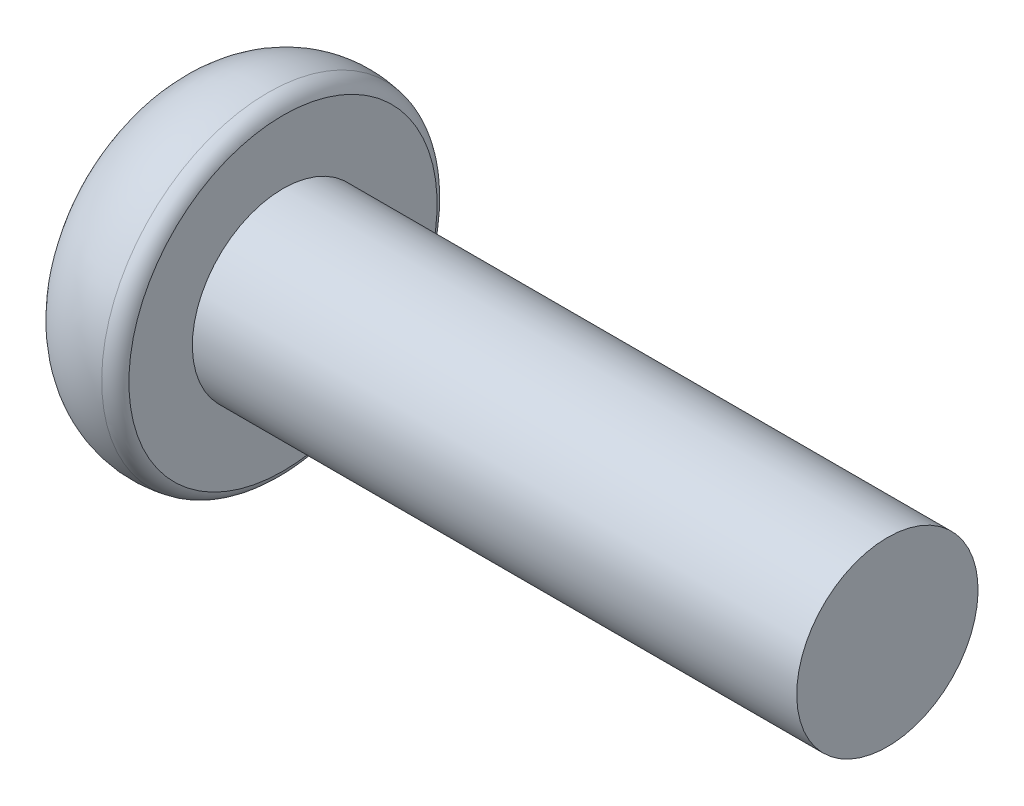
ISO-10303-21;
HEADER;
FILE_DESCRIPTION(('STEP AP214'),'2;1');
FILE_NAME('part.step','',(''),(''),'','','');
FILE_SCHEMA(('AUTOMOTIVE_DESIGN { 1 0 10303 214 1 1 1 1 }'));
ENDSEC;
DATA;
#1=APPLICATION_CONTEXT('core data for automotive mechanical design processes');
#2=APPLICATION_PROTOCOL_DEFINITION('international standard','automotive_design',2000,#1);
#3=PRODUCT_CONTEXT('',#1,'mechanical');
#4=PRODUCT('Part','Part','',(#3));
#5=PRODUCT_RELATED_PRODUCT_CATEGORY('part','',(#4));
#6=PRODUCT_DEFINITION_FORMATION('','',#4);
#7=PRODUCT_DEFINITION_CONTEXT('part definition',#1,'design');
#8=PRODUCT_DEFINITION('design','',#6,#7);
#9=PRODUCT_DEFINITION_SHAPE('','',#8);
#10=(LENGTH_UNIT() NAMED_UNIT(*) SI_UNIT(.MILLI.,.METRE.));
#11=(NAMED_UNIT(*) PLANE_ANGLE_UNIT() SI_UNIT($,.RADIAN.));
#12=(NAMED_UNIT(*) SI_UNIT($,.STERADIAN.) SOLID_ANGLE_UNIT());
#13=UNCERTAINTY_MEASURE_WITH_UNIT(LENGTH_MEASURE(1.E-05),#10,'distance_accuracy_value','');
#14=(GEOMETRIC_REPRESENTATION_CONTEXT(3) GLOBAL_UNCERTAINTY_ASSIGNED_CONTEXT((#13)) GLOBAL_UNIT_ASSIGNED_CONTEXT((#10,
#11,#12)) REPRESENTATION_CONTEXT('',''));
#15=CARTESIAN_POINT('',(0.,0.,0.));
#16=DIRECTION('',(0.,0.,1.));
#17=DIRECTION('',(1.,0.,0.));
#18=AXIS2_PLACEMENT_3D('',#15,#16,#17);
#19=CARTESIAN_POINT('',(0.,2.1,0.));
#20=DIRECTION('',(1.,0.,0.));
#21=DIRECTION('',(0.,1.,0.));
#22=AXIS2_PLACEMENT_3D('',#19,#20,#21);
#23=PLANE('',#22);
#24=CARTESIAN_POINT('',(0.,-3.,0.));
#25=DIRECTION('',(1.,0.,0.));
#26=DIRECTION('',(0.,1.,0.));
#27=AXIS2_PLACEMENT_3D('',#24,#25,#26);
#28=CIRCLE('',#27,5.1);
#29=CARTESIAN_POINT('',(0.,2.1,0.));
#30=VERTEX_POINT('',#29);
#31=EDGE_CURVE('E138',#30,#30,#28,.T.);
#32=ORIENTED_EDGE('',*,*,#31,.T.);
#33=EDGE_LOOP('',(#32));
#34=FACE_BOUND('',#33,.T.);
#35=CARTESIAN_POINT('',(0.,-3.,0.));
#36=DIRECTION('',(1.,0.,0.));
#37=DIRECTION('',(0.,1.,0.));
#38=AXIS2_PLACEMENT_3D('',#35,#36,#37);
#39=CIRCLE('',#38,3.);
#40=CARTESIAN_POINT('',(0.,0.,0.));
#41=VERTEX_POINT('',#40);
#42=EDGE_CURVE('E11',#41,#41,#39,.T.);
#43=ORIENTED_EDGE('',*,*,#42,.F.);
#44=EDGE_LOOP('',(#43));
#45=FACE_BOUND('',#44,.T.);
#46=ADVANCED_FACE('F37',(#34,#45),#23,.T.);
#47=CARTESIAN_POINT('',(20.,-3.,0.));
#48=DIRECTION('',(1.,0.,0.));
#49=DIRECTION('',(0.,1.,0.));
#50=AXIS2_PLACEMENT_3D('',#47,#48,#49);
#51=CYLINDRICAL_SURFACE('',#50,3.);
#52=ORIENTED_EDGE('',*,*,#42,.T.);
#53=EDGE_LOOP('',(#52));
#54=FACE_BOUND('',#53,.T.);
#55=CARTESIAN_POINT('',(20.,-3.,0.));
#56=DIRECTION('',(1.,0.,0.));
#57=DIRECTION('',(0.,1.,0.));
#58=AXIS2_PLACEMENT_3D('',#55,#56,#57);
#59=CIRCLE('',#58,3.);
#60=CARTESIAN_POINT('',(20.,0.,0.));
#61=VERTEX_POINT('',#60);
#62=EDGE_CURVE('E44',#61,#61,#59,.T.);
#63=ORIENTED_EDGE('',*,*,#62,.F.);
#64=EDGE_LOOP('',(#63));
#65=FACE_BOUND('',#64,.T.);
#66=ADVANCED_FACE('F156',(#54,#65),#51,.T.);
#67=CARTESIAN_POINT('',(20.,0.,0.));
#68=DIRECTION('',(1.,0.,0.));
#69=DIRECTION('',(0.,1.,0.));
#70=AXIS2_PLACEMENT_3D('',#67,#68,#69);
#71=PLANE('',#70);
#72=ORIENTED_EDGE('',*,*,#62,.T.);
#73=EDGE_LOOP('',(#72));
#74=FACE_BOUND('',#73,.T.);
#75=ADVANCED_FACE('F154',(#74),#71,.T.);
#76=CARTESIAN_POINT('',(-4.,-3.,0.));
#77=DIRECTION('',(-1.,0.,0.));
#78=DIRECTION('',(0.,-1.,0.));
#79=AXIS2_PLACEMENT_3D('',#76,#77,#78);
#80=PLANE('',#79);
#81=DIRECTION('',(0.,0.5,-0.866025403784439));
#82=VECTOR('',#81,1.);
#83=CARTESIAN_POINT('',(-4.,-1.72982940778283,2.2));
#84=LINE('',#83,#82);
#85=CARTESIAN_POINT('',(-4.,-1.72982940778283,2.2));
#86=VERTEX_POINT('',#85);
#87=CARTESIAN_POINT('',(-4.,-0.45965881556565,0.));
#88=VERTEX_POINT('',#87);
#89=EDGE_CURVE('E51',#86,#88,#84,.T.);
#90=ORIENTED_EDGE('',*,*,#89,.F.);
#91=DIRECTION('',(0.,1.,0.));
#92=VECTOR('',#91,1.);
#93=CARTESIAN_POINT('',(-4.,-4.27017059221718,2.2));
#94=LINE('',#93,#92);
#95=CARTESIAN_POINT('',(-4.,-4.27017059221718,2.2));
#96=VERTEX_POINT('',#95);
#97=EDGE_CURVE('E134',#96,#86,#94,.T.);
#98=ORIENTED_EDGE('',*,*,#97,.F.);
#99=DIRECTION('',(0.,0.5,0.866025403784439));
#100=VECTOR('',#99,1.);
#101=CARTESIAN_POINT('',(-4.,-5.54034118443435,0.));
#102=LINE('',#101,#100);
#103=CARTESIAN_POINT('',(-4.,-5.54034118443435,0.));
#104=VERTEX_POINT('',#103);
#105=EDGE_CURVE('E132',#104,#96,#102,.T.);
#106=ORIENTED_EDGE('',*,*,#105,.F.);
#107=DIRECTION('',(0.,-0.499999999999999,0.866025403784439));
#108=VECTOR('',#107,1.);
#109=CARTESIAN_POINT('',(-4.,-4.27017059221718,-2.2));
#110=LINE('',#109,#108);
#111=CARTESIAN_POINT('',(-4.,-4.27017059221718,-2.2));
#112=VERTEX_POINT('',#111);
#113=EDGE_CURVE('E99',#112,#104,#110,.T.);
#114=ORIENTED_EDGE('',*,*,#113,.F.);
#115=DIRECTION('',(0.,-1.,0.));
#116=VECTOR('',#115,1.);
#117=CARTESIAN_POINT('',(-4.,-1.72982940778283,-2.2));
#118=LINE('',#117,#116);
#119=CARTESIAN_POINT('',(-4.,-1.72982940778283,-2.2));
#120=VERTEX_POINT('',#119);
#121=EDGE_CURVE('E128',#120,#112,#118,.T.);
#122=ORIENTED_EDGE('',*,*,#121,.F.);
#123=DIRECTION('',(0.,-0.5,-0.866025403784439));
#124=VECTOR('',#123,1.);
#125=CARTESIAN_POINT('',(-4.,-0.45965881556565,0.));
#126=LINE('',#125,#124);
#127=EDGE_CURVE('E125',#88,#120,#126,.T.);
#128=ORIENTED_EDGE('',*,*,#127,.F.);
#129=EDGE_LOOP('',(#90,#98,#106,#114,#122,#128));
#130=FACE_BOUND('',#129,.T.);
#131=CARTESIAN_POINT('',(-4.,-3.,0.));
#132=DIRECTION('',(1.,0.,0.));
#133=DIRECTION('',(0.,1.,0.));
#134=AXIS2_PLACEMENT_3D('',#131,#132,#133);
#135=CIRCLE('',#134,3.);
#136=CARTESIAN_POINT('',(-4.,0.,0.));
#137=VERTEX_POINT('',#136);
#138=EDGE_CURVE('E149',#137,#137,#135,.T.);
#139=ORIENTED_EDGE('',*,*,#138,.F.);
#140=EDGE_LOOP('',(#139));
#141=FACE_BOUND('',#140,.T.);
#142=ADVANCED_FACE('F163',(#130,#141),#80,.T.);
#143=CARTESIAN_POINT('',(-1.06784095824631,-3.,0.));
#144=DIRECTION('',(1.,0.,0.));
#145=DIRECTION('',(0.,1.,0.));
#146=AXIS2_PLACEMENT_3D('',#143,#144,#145);
#147=DEGENERATE_TOROIDAL_SURFACE('',#146,2.59497734154483,2.96,.T.);
#148=ORIENTED_EDGE('',*,*,#138,.T.);
#149=EDGE_LOOP('',(#148));
#150=FACE_BOUND('',#149,.T.);
#151=CARTESIAN_POINT('',(-0.5,-3.,0.));
#152=DIRECTION('',(1.,0.,0.));
#153=DIRECTION('',(0.,1.,0.));
#154=AXIS2_PLACEMENT_3D('',#151,#152,#153);
#155=CIRCLE('',#154,5.5);
#156=CARTESIAN_POINT('',(-0.500000000000001,2.5,0.));
#157=VERTEX_POINT('',#156);
#158=EDGE_CURVE('E146',#157,#157,#155,.T.);
#159=ORIENTED_EDGE('',*,*,#158,.F.);
#160=EDGE_LOOP('',(#159));
#161=FACE_BOUND('',#160,.T.);
#162=ADVANCED_FACE('F169',(#150,#161),#147,.T.);
#163=CARTESIAN_POINT('',(-0.566998114943999,-3.,0.));
#164=DIRECTION('',(1.,0.,0.));
#165=DIRECTION('',(0.,1.,0.));
#166=AXIS2_PLACEMENT_3D('',#163,#164,#165);
#167=TOROIDAL_SURFACE('',#166,4.90375235632,0.6);
#168=ORIENTED_EDGE('',*,*,#158,.T.);
#169=EDGE_LOOP('',(#168));
#170=FACE_BOUND('',#169,.T.);
#171=ORIENTED_EDGE('',*,*,#31,.F.);
#172=EDGE_LOOP('',(#171));
#173=FACE_BOUND('',#172,.T.);
#174=ADVANCED_FACE('F173',(#170,#173),#167,.T.);
#175=CARTESIAN_POINT('',(-1.,-1.72982940778283,2.2));
#176=DIRECTION('',(0.,0.866025403784439,0.5));
#177=DIRECTION('',(0.,-0.5,0.866025403784439));
#178=AXIS2_PLACEMENT_3D('',#175,#176,#177);
#179=PLANE('',#178);
#180=ORIENTED_EDGE('',*,*,#89,.T.);
#181=DIRECTION('',(-1.,0.,0.));
#182=VECTOR('',#181,1.);
#183=CARTESIAN_POINT('',(-1.,-0.45965881556565,0.));
#184=LINE('',#183,#182);
#185=CARTESIAN_POINT('',(-1.,-0.45965881556565,0.));
#186=VERTEX_POINT('',#185);
#187=EDGE_CURVE('E81',#186,#88,#184,.T.);
#188=ORIENTED_EDGE('',*,*,#187,.F.);
#189=DIRECTION('',(0.,0.5,-0.866025403784439));
#190=VECTOR('',#189,1.);
#191=CARTESIAN_POINT('',(-1.,-1.72982940778283,2.2));
#192=LINE('',#191,#190);
#193=CARTESIAN_POINT('',(-1.,-1.72982940778283,2.2));
#194=VERTEX_POINT('',#193);
#195=EDGE_CURVE('E136',#194,#186,#192,.T.);
#196=ORIENTED_EDGE('',*,*,#195,.F.);
#197=DIRECTION('',(-1.,0.,0.));
#198=VECTOR('',#197,1.);
#199=CARTESIAN_POINT('',(-1.,-1.72982940778283,2.2));
#200=LINE('',#199,#198);
#201=EDGE_CURVE('E59',#194,#86,#200,.T.);
#202=ORIENTED_EDGE('',*,*,#201,.T.);
#203=EDGE_LOOP('',(#180,#188,#196,#202));
#204=FACE_BOUND('',#203,.T.);
#205=ADVANCED_FACE('F177',(#204),#179,.F.);
#206=CARTESIAN_POINT('',(-1.,-4.27017059221718,2.2));
#207=DIRECTION('',(0.,0.,1.));
#208=DIRECTION('',(1.,0.,0.));
#209=AXIS2_PLACEMENT_3D('',#206,#207,#208);
#210=PLANE('',#209);
#211=ORIENTED_EDGE('',*,*,#97,.T.);
#212=ORIENTED_EDGE('',*,*,#201,.F.);
#213=DIRECTION('',(0.,1.,0.));
#214=VECTOR('',#213,1.);
#215=CARTESIAN_POINT('',(-1.,-4.27017059221718,2.2));
#216=LINE('',#215,#214);
#217=CARTESIAN_POINT('',(-1.,-4.27017059221718,2.2));
#218=VERTEX_POINT('',#217);
#219=EDGE_CURVE('E111',#218,#194,#216,.T.);
#220=ORIENTED_EDGE('',*,*,#219,.F.);
#221=DIRECTION('',(-1.,0.,0.));
#222=VECTOR('',#221,1.);
#223=CARTESIAN_POINT('',(-1.,-4.27017059221718,2.2));
#224=LINE('',#223,#222);
#225=EDGE_CURVE('E103',#218,#96,#224,.T.);
#226=ORIENTED_EDGE('',*,*,#225,.T.);
#227=EDGE_LOOP('',(#211,#212,#220,#226));
#228=FACE_BOUND('',#227,.T.);
#229=ADVANCED_FACE('F181',(#228),#210,.F.);
#230=CARTESIAN_POINT('',(-1.,-5.54034118443435,0.));
#231=DIRECTION('',(0.,-0.866025403784439,0.5));
#232=DIRECTION('',(0.,-0.5,-0.866025403784439));
#233=AXIS2_PLACEMENT_3D('',#230,#231,#232);
#234=PLANE('',#233);
#235=ORIENTED_EDGE('',*,*,#105,.T.);
#236=ORIENTED_EDGE('',*,*,#225,.F.);
#237=DIRECTION('',(0.,0.5,0.866025403784439));
#238=VECTOR('',#237,1.);
#239=CARTESIAN_POINT('',(-1.,-5.54034118443435,0.));
#240=LINE('',#239,#238);
#241=CARTESIAN_POINT('',(-1.,-5.54034118443435,0.));
#242=VERTEX_POINT('',#241);
#243=EDGE_CURVE('E107',#242,#218,#240,.T.);
#244=ORIENTED_EDGE('',*,*,#243,.F.);
#245=DIRECTION('',(-1.,0.,0.));
#246=VECTOR('',#245,1.);
#247=CARTESIAN_POINT('',(-1.,-5.54034118443435,0.));
#248=LINE('',#247,#246);
#249=EDGE_CURVE('E92',#242,#104,#248,.T.);
#250=ORIENTED_EDGE('',*,*,#249,.T.);
#251=EDGE_LOOP('',(#235,#236,#244,#250));
#252=FACE_BOUND('',#251,.T.);
#253=ADVANCED_FACE('F108',(#252),#234,.F.);
#254=CARTESIAN_POINT('',(-1.,-4.27017059221718,-2.2));
#255=DIRECTION('',(0.,-0.866025403784439,-0.5));
#256=DIRECTION('',(0.,0.5,-0.866025403784439));
#257=AXIS2_PLACEMENT_3D('',#254,#255,#256);
#258=PLANE('',#257);
#259=ORIENTED_EDGE('',*,*,#113,.T.);
#260=ORIENTED_EDGE('',*,*,#249,.F.);
#261=DIRECTION('',(0.,-0.499999999999999,0.866025403784439));
#262=VECTOR('',#261,1.);
#263=CARTESIAN_POINT('',(-1.,-4.27017059221718,-2.2));
#264=LINE('',#263,#262);
#265=CARTESIAN_POINT('',(-1.,-4.27017059221718,-2.2));
#266=VERTEX_POINT('',#265);
#267=EDGE_CURVE('E96',#266,#242,#264,.T.);
#268=ORIENTED_EDGE('',*,*,#267,.F.);
#269=DIRECTION('',(-1.,0.,0.));
#270=VECTOR('',#269,1.);
#271=CARTESIAN_POINT('',(-1.,-4.27017059221718,-2.2));
#272=LINE('',#271,#270);
#273=EDGE_CURVE('E104',#266,#112,#272,.T.);
#274=ORIENTED_EDGE('',*,*,#273,.T.);
#275=EDGE_LOOP('',(#259,#260,#268,#274));
#276=FACE_BOUND('',#275,.T.);
#277=ADVANCED_FACE('F94',(#276),#258,.F.);
#278=CARTESIAN_POINT('',(-1.,-1.72982940778283,-2.2));
#279=DIRECTION('',(0.,0.,-1.));
#280=DIRECTION('',(0.,1.,0.));
#281=AXIS2_PLACEMENT_3D('',#278,#279,#280);
#282=PLANE('',#281);
#283=ORIENTED_EDGE('',*,*,#121,.T.);
#284=ORIENTED_EDGE('',*,*,#273,.F.);
#285=DIRECTION('',(0.,-1.,0.));
#286=VECTOR('',#285,1.);
#287=CARTESIAN_POINT('',(-1.,-1.72982940778283,-2.2));
#288=LINE('',#287,#286);
#289=CARTESIAN_POINT('',(-1.,-1.72982940778283,-2.2));
#290=VERTEX_POINT('',#289);
#291=EDGE_CURVE('E117',#290,#266,#288,.T.);
#292=ORIENTED_EDGE('',*,*,#291,.F.);
#293=DIRECTION('',(-1.,0.,0.));
#294=VECTOR('',#293,1.);
#295=CARTESIAN_POINT('',(-1.,-1.72982940778283,-2.2));
#296=LINE('',#295,#294);
#297=EDGE_CURVE('E141',#290,#120,#296,.T.);
#298=ORIENTED_EDGE('',*,*,#297,.T.);
#299=EDGE_LOOP('',(#283,#284,#292,#298));
#300=FACE_BOUND('',#299,.T.);
#301=ADVANCED_FACE('F185',(#300),#282,.F.);
#302=CARTESIAN_POINT('',(-1.,-0.45965881556565,0.));
#303=DIRECTION('',(0.,0.866025403784439,-0.5));
#304=DIRECTION('',(0.,0.5,0.866025403784439));
#305=AXIS2_PLACEMENT_3D('',#302,#303,#304);
#306=PLANE('',#305);
#307=ORIENTED_EDGE('',*,*,#127,.T.);
#308=ORIENTED_EDGE('',*,*,#297,.F.);
#309=DIRECTION('',(0.,-0.5,-0.866025403784439));
#310=VECTOR('',#309,1.);
#311=CARTESIAN_POINT('',(-1.,-0.45965881556565,0.));
#312=LINE('',#311,#310);
#313=EDGE_CURVE('E119',#186,#290,#312,.T.);
#314=ORIENTED_EDGE('',*,*,#313,.F.);
#315=ORIENTED_EDGE('',*,*,#187,.T.);
#316=EDGE_LOOP('',(#307,#308,#314,#315));
#317=FACE_BOUND('',#316,.T.);
#318=ADVANCED_FACE('F182',(#317),#306,.F.);
#319=CARTESIAN_POINT('',(-1.,0.,0.));
#320=DIRECTION('',(-1.,0.,0.));
#321=DIRECTION('',(0.,0.,1.));
#322=AXIS2_PLACEMENT_3D('',#319,#320,#321);
#323=PLANE('',#322);
#324=ORIENTED_EDGE('',*,*,#195,.T.);
#325=ORIENTED_EDGE('',*,*,#313,.T.);
#326=ORIENTED_EDGE('',*,*,#291,.T.);
#327=ORIENTED_EDGE('',*,*,#267,.T.);
#328=ORIENTED_EDGE('',*,*,#243,.T.);
#329=ORIENTED_EDGE('',*,*,#219,.T.);
#330=EDGE_LOOP('',(#324,#325,#326,#327,#328,#329));
#331=FACE_BOUND('',#330,.T.);
#332=ADVANCED_FACE('F114',(#331),#323,.T.);
#333=CLOSED_SHELL('',(#46,#66,#75,#142,#162,#174,#205,#229,#253,#277,#301,#318,#332));
#334=MANIFOLD_SOLID_BREP('B2',#333);
#335=ADVANCED_BREP_SHAPE_REPRESENTATION('',(#18,#334),#14);
#336=SHAPE_DEFINITION_REPRESENTATION(#9,#335);
ENDSEC;
END-ISO-10303-21;
